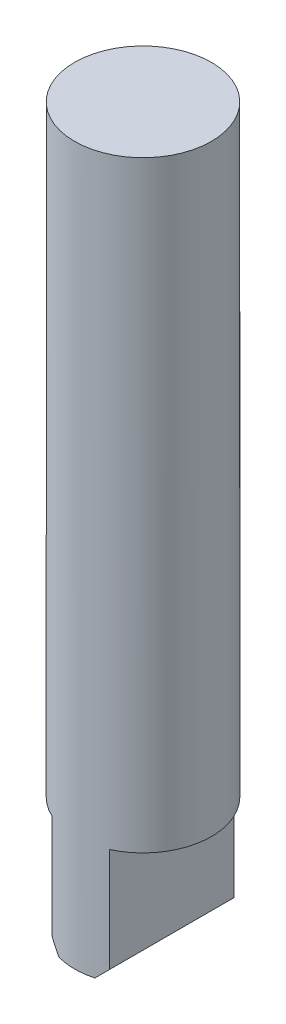
ISO-10303-21;
HEADER;
FILE_DESCRIPTION(('STEP AP214'),'2;1');
FILE_NAME('part.step','',(''),(''),'','','');
FILE_SCHEMA(('AUTOMOTIVE_DESIGN { 1 0 10303 214 1 1 1 1 }'));
ENDSEC;
DATA;
#1=APPLICATION_CONTEXT('core data for automotive mechanical design processes');
#2=APPLICATION_PROTOCOL_DEFINITION('international standard','automotive_design',2000,#1);
#3=PRODUCT_CONTEXT('',#1,'mechanical');
#4=PRODUCT('Part','Part','',(#3));
#5=PRODUCT_RELATED_PRODUCT_CATEGORY('part','',(#4));
#6=PRODUCT_DEFINITION_FORMATION('','',#4);
#7=PRODUCT_DEFINITION_CONTEXT('part definition',#1,'design');
#8=PRODUCT_DEFINITION('design','',#6,#7);
#9=PRODUCT_DEFINITION_SHAPE('','',#8);
#10=(LENGTH_UNIT() NAMED_UNIT(*) SI_UNIT(.MILLI.,.METRE.));
#11=(NAMED_UNIT(*) PLANE_ANGLE_UNIT() SI_UNIT($,.RADIAN.));
#12=(NAMED_UNIT(*) SI_UNIT($,.STERADIAN.) SOLID_ANGLE_UNIT());
#13=UNCERTAINTY_MEASURE_WITH_UNIT(LENGTH_MEASURE(1.E-05),#10,'distance_accuracy_value','');
#14=(GEOMETRIC_REPRESENTATION_CONTEXT(3) GLOBAL_UNCERTAINTY_ASSIGNED_CONTEXT((#13)) GLOBAL_UNIT_ASSIGNED_CONTEXT((#10,
#11,#12)) REPRESENTATION_CONTEXT('',''));
#15=CARTESIAN_POINT('',(0.,0.,0.));
#16=DIRECTION('',(0.,0.,1.));
#17=DIRECTION('',(1.,0.,0.));
#18=AXIS2_PLACEMENT_3D('',#15,#16,#17);
#19=CARTESIAN_POINT('',(0.,50.,0.));
#20=DIRECTION('',(0.,-1.,0.));
#21=DIRECTION('',(0.,0.,-1.00000000000001));
#22=AXIS2_PLACEMENT_3D('',#19,#20,#21);
#23=CYLINDRICAL_SURFACE('',#22,4.775);
#24=CARTESIAN_POINT('',(0.,50.,0.));
#25=DIRECTION('',(0.,1.,0.));
#26=DIRECTION('',(0.,0.,1.00000000000001));
#27=AXIS2_PLACEMENT_3D('',#24,#25,#26);
#28=CIRCLE('',#27,4.775);
#29=CARTESIAN_POINT('',(0.,50.,4.77500000000003));
#30=VERTEX_POINT('',#29);
#31=EDGE_CURVE('E114',#30,#30,#28,.T.);
#32=ORIENTED_EDGE('',*,*,#31,.F.);
#33=EDGE_LOOP('',(#32));
#34=FACE_BOUND('',#33,.T.);
#35=DIRECTION('',(0.,-1.,0.));
#36=VECTOR('',#35,1.);
#37=CARTESIAN_POINT('',(-2.00000000000106,50.0000000000001,4.3359687498874));
#38=LINE('',#37,#36);
#39=CARTESIAN_POINT('',(-2.00000000000033,0.750000000000042,4.3359687498874));
#40=VERTEX_POINT('',#39);
#41=CARTESIAN_POINT('',(-2.00000000000072,8.00000000000001,4.33596874988745));
#42=VERTEX_POINT('',#41);
#43=EDGE_CURVE('E97',#40,#42,#38,.F.);
#44=ORIENTED_EDGE('',*,*,#43,.F.);
#45=CARTESIAN_POINT('',(0.,-1.24999999999997,0.));
#46=DIRECTION('',(-0.707106781186558,-0.707106781186544,0.));
#47=DIRECTION('',(0.707106781186551,-0.707106781186551,0.));
#48=AXIS2_PLACEMENT_3D('',#45,#46,#47);
#49=ELLIPSE('',#48,6.75286976033156,4.775);
#50=CARTESIAN_POINT('',(-1.24999999999997,0.,4.60848402405867));
#51=VERTEX_POINT('',#50);
#52=EDGE_CURVE('E130',#40,#51,#49,.F.);
#53=ORIENTED_EDGE('',*,*,#52,.T.);
#54=CARTESIAN_POINT('',(0.,0.,0.));
#55=DIRECTION('',(0.,1.,0.));
#56=DIRECTION('',(0.,0.,1.00000000000001));
#57=AXIS2_PLACEMENT_3D('',#54,#55,#56);
#58=CIRCLE('',#57,4.775);
#59=CARTESIAN_POINT('',(1.2500000000002,0.,4.60848402405889));
#60=VERTEX_POINT('',#59);
#61=EDGE_CURVE('E122',#51,#60,#58,.T.);
#62=ORIENTED_EDGE('',*,*,#61,.T.);
#63=CARTESIAN_POINT('',(0.,-1.24999999999997,0.));
#64=DIRECTION('',(-0.707106781186555,0.707106781186547,0.));
#65=DIRECTION('',(-0.707106781186554,-0.707106781186548,0.));
#66=AXIS2_PLACEMENT_3D('',#63,#64,#65);
#67=ELLIPSE('',#66,6.75286976033153,4.775);
#68=CARTESIAN_POINT('',(1.99999999999984,0.750000000000042,4.33596874988817));
#69=VERTEX_POINT('',#68);
#70=EDGE_CURVE('E59',#60,#69,#67,.T.);
#71=ORIENTED_EDGE('',*,*,#70,.T.);
#72=DIRECTION('',(0.,-1.,0.));
#73=VECTOR('',#72,1.);
#74=CARTESIAN_POINT('',(1.99999999999884,50.,4.33596874988784));
#75=LINE('',#74,#73);
#76=CARTESIAN_POINT('',(1.99999999999922,8.00000000000002,4.33596874988795));
#77=VERTEX_POINT('',#76);
#78=EDGE_CURVE('E145',#69,#77,#75,.F.);
#79=ORIENTED_EDGE('',*,*,#78,.T.);
#80=CARTESIAN_POINT('',(-7.7715611723761E-13,8.00000000000001,0.));
#81=DIRECTION('',(0.,-1.,0.));
#82=DIRECTION('',(0.,0.,-1.00000000000001));
#83=AXIS2_PLACEMENT_3D('',#80,#81,#82);
#84=CIRCLE('',#83,4.775);
#85=CARTESIAN_POINT('',(1.99999999999989,8.00000000000001,-4.3359687498874));
#86=VERTEX_POINT('',#85);
#87=EDGE_CURVE('E113',#86,#77,#84,.T.);
#88=ORIENTED_EDGE('',*,*,#87,.F.);
#89=DIRECTION('',(0.,-1.,0.));
#90=VECTOR('',#89,1.);
#91=CARTESIAN_POINT('',(2.00000000000022,50.,-4.3359687498874));
#92=LINE('',#91,#90);
#93=CARTESIAN_POINT('',(2.00000000000028,0.750000000000022,-4.3359687498874));
#94=VERTEX_POINT('',#93);
#95=EDGE_CURVE('E144',#86,#94,#92,.T.);
#96=ORIENTED_EDGE('',*,*,#95,.T.);
#97=CARTESIAN_POINT('',(0.,-1.24999999999997,0.));
#98=DIRECTION('',(-0.707106781186555,0.707106781186547,0.));
#99=DIRECTION('',(-0.707106781186554,-0.707106781186548,0.));
#100=AXIS2_PLACEMENT_3D('',#97,#98,#99);
#101=ELLIPSE('',#100,6.75286976033153,4.775);
#102=CARTESIAN_POINT('',(1.24999999999997,0.,-4.60848402405822));
#103=VERTEX_POINT('',#102);
#104=EDGE_CURVE('E125',#94,#103,#101,.T.);
#105=ORIENTED_EDGE('',*,*,#104,.T.);
#106=CARTESIAN_POINT('',(-1.25000000000003,0.,-4.60848402405822));
#107=VERTEX_POINT('',#106);
#108=EDGE_CURVE('E119',#103,#107,#58,.T.);
#109=ORIENTED_EDGE('',*,*,#108,.T.);
#110=CARTESIAN_POINT('',(0.,-1.24999999999997,0.));
#111=DIRECTION('',(-0.707106781186558,-0.707106781186544,0.));
#112=DIRECTION('',(0.707106781186551,-0.707106781186551,0.));
#113=AXIS2_PLACEMENT_3D('',#110,#111,#112);
#114=ELLIPSE('',#113,6.75286976033156,4.775);
#115=CARTESIAN_POINT('',(-2.00000000000039,0.750000000000022,-4.33596874988762));
#116=VERTEX_POINT('',#115);
#117=EDGE_CURVE('E128',#107,#116,#114,.F.);
#118=ORIENTED_EDGE('',*,*,#117,.T.);
#119=DIRECTION('',(0.,-1.,0.));
#120=VECTOR('',#119,1.);
#121=CARTESIAN_POINT('',(-2.00000000000039,50.0000000000001,-4.33596874988762));
#122=LINE('',#121,#120);
#123=CARTESIAN_POINT('',(-2.00000000000072,8.00000000000001,-4.33596874988762));
#124=VERTEX_POINT('',#123);
#125=EDGE_CURVE('E106',#124,#116,#122,.T.);
#126=ORIENTED_EDGE('',*,*,#125,.F.);
#127=CARTESIAN_POINT('',(-7.7715611723761E-13,8.00000000000001,0.));
#128=DIRECTION('',(0.,-1.,0.));
#129=DIRECTION('',(0.,0.,-1.00000000000001));
#130=AXIS2_PLACEMENT_3D('',#127,#128,#129);
#131=CIRCLE('',#130,4.775);
#132=EDGE_CURVE('E111',#42,#124,#131,.T.);
#133=ORIENTED_EDGE('',*,*,#132,.F.);
#134=EDGE_LOOP('',(#44,#53,#62,#71,#79,#88,#96,#105,#109,#118,#126,#133));
#135=FACE_BOUND('',#134,.T.);
#136=ADVANCED_FACE('F43',(#34,#135),#23,.T.);
#137=CARTESIAN_POINT('',(0.,0.,0.));
#138=DIRECTION('',(0.,1.,0.));
#139=DIRECTION('',(0.,0.,1.00000000000001));
#140=AXIS2_PLACEMENT_3D('',#137,#138,#139);
#141=PLANE('',#140);
#142=ORIENTED_EDGE('',*,*,#61,.F.);
#143=DIRECTION('',(0.,0.,-1.00000000000001));
#144=VECTOR('',#143,1.);
#145=CARTESIAN_POINT('',(-1.24999999999992,0.,-4.3359687498874));
#146=LINE('',#145,#144);
#147=EDGE_CURVE('E52',#51,#107,#146,.T.);
#148=ORIENTED_EDGE('',*,*,#147,.T.);
#149=ORIENTED_EDGE('',*,*,#108,.F.);
#150=DIRECTION('',(0.,0.,1.00000000000001));
#151=VECTOR('',#150,1.);
#152=CARTESIAN_POINT('',(1.25000000000108,0.,2.77555756156289E-13));
#153=LINE('',#152,#151);
#154=EDGE_CURVE('E132',#103,#60,#153,.T.);
#155=ORIENTED_EDGE('',*,*,#154,.T.);
#156=EDGE_LOOP('',(#142,#148,#149,#155));
#157=FACE_BOUND('',#156,.T.);
#158=ADVANCED_FACE('F138',(#157),#141,.F.);
#159=CARTESIAN_POINT('',(0.,50.,0.));
#160=DIRECTION('',(0.,1.,0.));
#161=DIRECTION('',(0.,0.,1.00000000000001));
#162=AXIS2_PLACEMENT_3D('',#159,#160,#161);
#163=PLANE('',#162);
#164=ORIENTED_EDGE('',*,*,#31,.T.);
#165=EDGE_LOOP('',(#164));
#166=FACE_BOUND('',#165,.T.);
#167=ADVANCED_FACE('F169',(#166),#163,.T.);
#168=CARTESIAN_POINT('',(-7.7715611723761E-13,8.00000000000001,0.));
#169=DIRECTION('',(0.,-1.,0.));
#170=DIRECTION('',(0.,0.,-1.00000000000001));
#171=AXIS2_PLACEMENT_3D('',#168,#169,#170);
#172=PLANE('',#171);
#173=ORIENTED_EDGE('',*,*,#132,.T.);
#174=DIRECTION('',(0.,0.,-1.00000000000001));
#175=VECTOR('',#174,1.);
#176=CARTESIAN_POINT('',(-2.00000000000078,8.,2.22044604925031E-13));
#177=LINE('',#176,#175);
#178=EDGE_CURVE('E101',#42,#124,#177,.T.);
#179=ORIENTED_EDGE('',*,*,#178,.F.);
#180=EDGE_LOOP('',(#173,#179));
#181=FACE_BOUND('',#180,.T.);
#182=ADVANCED_FACE('F110',(#181),#172,.T.);
#183=CARTESIAN_POINT('',(-2.00000000000078,8.,2.22044604925031E-13));
#184=DIRECTION('',(-1.00000000000001,0.,0.));
#185=DIRECTION('',(0.,0.,1.00000000000001));
#186=AXIS2_PLACEMENT_3D('',#183,#184,#185);
#187=PLANE('',#186);
#188=ORIENTED_EDGE('',*,*,#125,.T.);
#189=DIRECTION('',(0.,0.,1.00000000000001));
#190=VECTOR('',#189,1.);
#191=CARTESIAN_POINT('',(-2.00000000000033,0.750000000000042,4.3359687498874));
#192=LINE('',#191,#190);
#193=EDGE_CURVE('E104',#116,#40,#192,.T.);
#194=ORIENTED_EDGE('',*,*,#193,.T.);
#195=ORIENTED_EDGE('',*,*,#43,.T.);
#196=ORIENTED_EDGE('',*,*,#178,.T.);
#197=EDGE_LOOP('',(#188,#194,#195,#196));
#198=FACE_BOUND('',#197,.T.);
#199=ADVANCED_FACE('F100',(#198),#187,.T.);
#200=CARTESIAN_POINT('',(-7.7715611723761E-13,8.00000000000001,0.));
#201=DIRECTION('',(0.,-1.,0.));
#202=DIRECTION('',(0.,0.,-1.00000000000001));
#203=AXIS2_PLACEMENT_3D('',#200,#201,#202);
#204=PLANE('',#203);
#205=ORIENTED_EDGE('',*,*,#87,.T.);
#206=DIRECTION('',(0.,0.,-1.00000000000001));
#207=VECTOR('',#206,1.);
#208=CARTESIAN_POINT('',(1.99999999999922,8.00000000000001,1.66533453693773E-13));
#209=LINE('',#208,#207);
#210=EDGE_CURVE('E107',#77,#86,#209,.T.);
#211=ORIENTED_EDGE('',*,*,#210,.T.);
#212=EDGE_LOOP('',(#205,#211));
#213=FACE_BOUND('',#212,.T.);
#214=ADVANCED_FACE('F154',(#213),#204,.T.);
#215=CARTESIAN_POINT('',(1.99999999999922,8.00000000000001,1.66533453693773E-13));
#216=DIRECTION('',(-1.00000000000001,0.,0.));
#217=DIRECTION('',(0.,0.,1.00000000000001));
#218=AXIS2_PLACEMENT_3D('',#215,#216,#217);
#219=PLANE('',#218);
#220=ORIENTED_EDGE('',*,*,#78,.F.);
#221=DIRECTION('',(0.,0.,-1.00000000000001));
#222=VECTOR('',#221,1.);
#223=CARTESIAN_POINT('',(2.,0.750000000000022,2.22044604925031E-13));
#224=LINE('',#223,#222);
#225=EDGE_CURVE('E11',#69,#94,#224,.T.);
#226=ORIENTED_EDGE('',*,*,#225,.T.);
#227=ORIENTED_EDGE('',*,*,#95,.F.);
#228=ORIENTED_EDGE('',*,*,#210,.F.);
#229=EDGE_LOOP('',(#220,#226,#227,#228));
#230=FACE_BOUND('',#229,.T.);
#231=ADVANCED_FACE('F156',(#230),#219,.F.);
#232=CARTESIAN_POINT('',(-1.99999999999978,0.750000000000063,7.7715611723761E-13));
#233=DIRECTION('',(-0.707106781186558,-0.707106781186544,0.));
#234=DIRECTION('',(0.,0.,-1.00000000000001));
#235=AXIS2_PLACEMENT_3D('',#232,#233,#234);
#236=PLANE('',#235);
#237=ORIENTED_EDGE('',*,*,#117,.F.);
#238=ORIENTED_EDGE('',*,*,#147,.F.);
#239=ORIENTED_EDGE('',*,*,#52,.F.);
#240=ORIENTED_EDGE('',*,*,#193,.F.);
#241=EDGE_LOOP('',(#237,#238,#239,#240));
#242=FACE_BOUND('',#241,.T.);
#243=ADVANCED_FACE('F143',(#242),#236,.T.);
#244=CARTESIAN_POINT('',(1.25000000000108,0.,2.77555756156289E-13));
#245=DIRECTION('',(-0.707106781186555,0.707106781186547,0.));
#246=DIRECTION('',(0.,0.,1.00000000000001));
#247=AXIS2_PLACEMENT_3D('',#244,#245,#246);
#248=PLANE('',#247);
#249=ORIENTED_EDGE('',*,*,#104,.F.);
#250=ORIENTED_EDGE('',*,*,#225,.F.);
#251=ORIENTED_EDGE('',*,*,#70,.F.);
#252=ORIENTED_EDGE('',*,*,#154,.F.);
#253=EDGE_LOOP('',(#249,#250,#251,#252));
#254=FACE_BOUND('',#253,.T.);
#255=ADVANCED_FACE('F46',(#254),#248,.F.);
#256=CLOSED_SHELL('',(#136,#158,#167,#182,#199,#214,#231,#243,#255));
#257=MANIFOLD_SOLID_BREP('B2',#256);
#258=ADVANCED_BREP_SHAPE_REPRESENTATION('',(#18,#257),#14);
#259=SHAPE_DEFINITION_REPRESENTATION(#9,#258);
ENDSEC;
END-ISO-10303-21;
